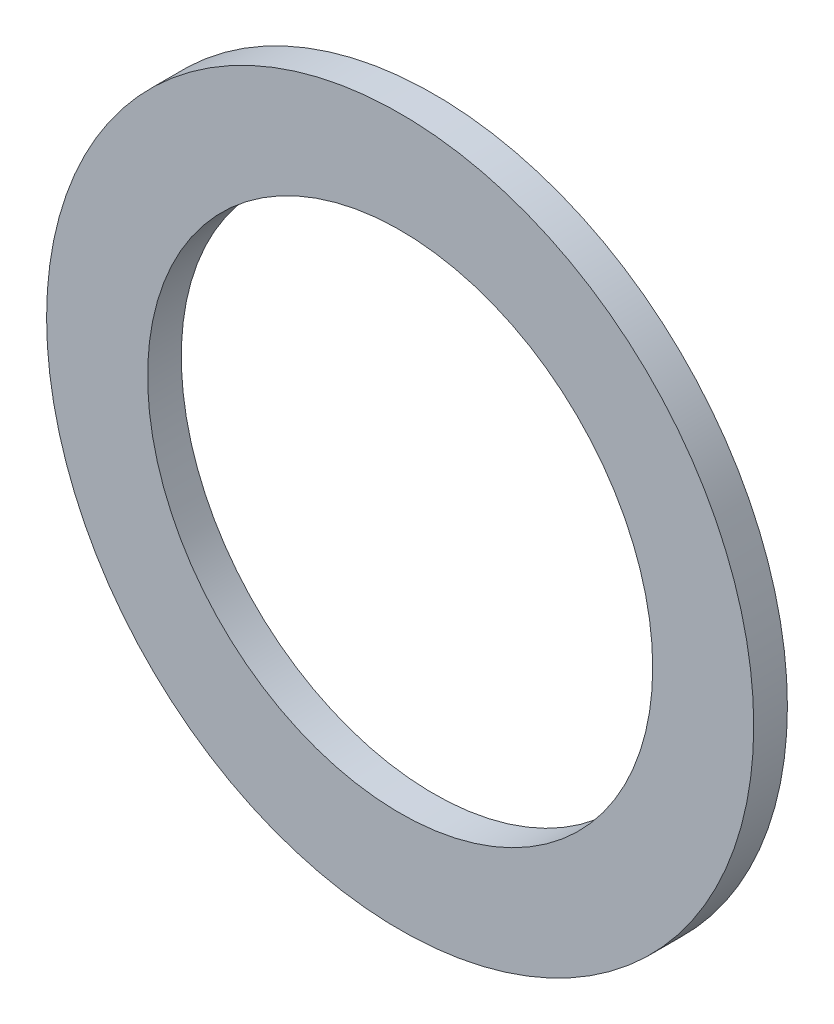
ISO-10303-21;
HEADER;
FILE_DESCRIPTION(('STEP AP214'),'2;1');
FILE_NAME('part.step','',(''),(''),'','','');
FILE_SCHEMA(('AUTOMOTIVE_DESIGN { 1 0 10303 214 1 1 1 1 }'));
ENDSEC;
DATA;
#1=APPLICATION_CONTEXT('core data for automotive mechanical design processes');
#2=APPLICATION_PROTOCOL_DEFINITION('international standard','automotive_design',2000,#1);
#3=PRODUCT_CONTEXT('',#1,'mechanical');
#4=PRODUCT('Part','Part','',(#3));
#5=PRODUCT_RELATED_PRODUCT_CATEGORY('part','',(#4));
#6=PRODUCT_DEFINITION_FORMATION('','',#4);
#7=PRODUCT_DEFINITION_CONTEXT('part definition',#1,'design');
#8=PRODUCT_DEFINITION('design','',#6,#7);
#9=PRODUCT_DEFINITION_SHAPE('','',#8);
#10=(LENGTH_UNIT() NAMED_UNIT(*) SI_UNIT(.MILLI.,.METRE.));
#11=(NAMED_UNIT(*) PLANE_ANGLE_UNIT() SI_UNIT($,.RADIAN.));
#12=(NAMED_UNIT(*) SI_UNIT($,.STERADIAN.) SOLID_ANGLE_UNIT());
#13=UNCERTAINTY_MEASURE_WITH_UNIT(LENGTH_MEASURE(1.E-05),#10,'distance_accuracy_value','');
#14=(GEOMETRIC_REPRESENTATION_CONTEXT(3) GLOBAL_UNCERTAINTY_ASSIGNED_CONTEXT((#13)) GLOBAL_UNIT_ASSIGNED_CONTEXT((#10,
#11,#12)) REPRESENTATION_CONTEXT('',''));
#15=CARTESIAN_POINT('',(0.,0.,0.));
#16=DIRECTION('',(0.,0.,1.));
#17=DIRECTION('',(1.,0.,0.));
#18=AXIS2_PLACEMENT_3D('',#15,#16,#17);
#19=CARTESIAN_POINT('',(0.,0.,1.));
#20=DIRECTION('',(0.,0.,1.));
#21=DIRECTION('',(1.,0.,0.));
#22=AXIS2_PLACEMENT_3D('',#19,#20,#21);
#23=PLANE('',#22);
#24=CARTESIAN_POINT('',(0.,0.,1.));
#25=DIRECTION('',(0.,0.,1.));
#26=DIRECTION('',(1.,0.,0.));
#27=AXIS2_PLACEMENT_3D('',#24,#25,#26);
#28=CIRCLE('',#27,10.5);
#29=CARTESIAN_POINT('',(10.5,0.,1.));
#30=VERTEX_POINT('',#29);
#31=EDGE_CURVE('E10',#30,#30,#28,.T.);
#32=ORIENTED_EDGE('',*,*,#31,.T.);
#33=EDGE_LOOP('',(#32));
#34=FACE_BOUND('',#33,.T.);
#35=CARTESIAN_POINT('',(0.,0.,1.));
#36=DIRECTION('',(0.,0.,1.));
#37=DIRECTION('',(1.,0.,0.));
#38=AXIS2_PLACEMENT_3D('',#35,#36,#37);
#39=CIRCLE('',#38,7.5);
#40=CARTESIAN_POINT('',(7.5,0.,1.));
#41=VERTEX_POINT('',#40);
#42=EDGE_CURVE('E41',#41,#41,#39,.T.);
#43=ORIENTED_EDGE('',*,*,#42,.F.);
#44=EDGE_LOOP('',(#43));
#45=FACE_BOUND('',#44,.T.);
#46=ADVANCED_FACE('F30',(#34,#45),#23,.T.);
#47=CARTESIAN_POINT('',(0.,0.,0.));
#48=DIRECTION('',(0.,0.,1.));
#49=DIRECTION('',(1.,0.,0.));
#50=AXIS2_PLACEMENT_3D('',#47,#48,#49);
#51=PLANE('',#50);
#52=CARTESIAN_POINT('',(0.,0.,0.));
#53=DIRECTION('',(0.,0.,1.));
#54=DIRECTION('',(1.,0.,0.));
#55=AXIS2_PLACEMENT_3D('',#52,#53,#54);
#56=CIRCLE('',#55,10.5);
#57=CARTESIAN_POINT('',(10.5,0.,0.));
#58=VERTEX_POINT('',#57);
#59=EDGE_CURVE('E34',#58,#58,#56,.T.);
#60=ORIENTED_EDGE('',*,*,#59,.F.);
#61=EDGE_LOOP('',(#60));
#62=FACE_BOUND('',#61,.T.);
#63=CARTESIAN_POINT('',(0.,0.,0.));
#64=DIRECTION('',(0.,0.,1.));
#65=DIRECTION('',(1.,0.,0.));
#66=AXIS2_PLACEMENT_3D('',#63,#64,#65);
#67=CIRCLE('',#66,7.5);
#68=CARTESIAN_POINT('',(7.5,0.,0.));
#69=VERTEX_POINT('',#68);
#70=EDGE_CURVE('E43',#69,#69,#67,.T.);
#71=ORIENTED_EDGE('',*,*,#70,.T.);
#72=EDGE_LOOP('',(#71));
#73=FACE_BOUND('',#72,.T.);
#74=ADVANCED_FACE('F53',(#62,#73),#51,.F.);
#75=CARTESIAN_POINT('',(0.,0.,1.));
#76=DIRECTION('',(0.,0.,-1.));
#77=DIRECTION('',(-1.,0.,0.));
#78=AXIS2_PLACEMENT_3D('',#75,#76,#77);
#79=CYLINDRICAL_SURFACE('',#78,10.5);
#80=ORIENTED_EDGE('',*,*,#31,.F.);
#81=EDGE_LOOP('',(#80));
#82=FACE_BOUND('',#81,.T.);
#83=ORIENTED_EDGE('',*,*,#59,.T.);
#84=EDGE_LOOP('',(#83));
#85=FACE_BOUND('',#84,.T.);
#86=ADVANCED_FACE('F32',(#82,#85),#79,.T.);
#87=CARTESIAN_POINT('',(0.,0.,1.));
#88=DIRECTION('',(0.,0.,-1.));
#89=DIRECTION('',(-1.,0.,0.));
#90=AXIS2_PLACEMENT_3D('',#87,#88,#89);
#91=CYLINDRICAL_SURFACE('',#90,7.5);
#92=ORIENTED_EDGE('',*,*,#42,.T.);
#93=EDGE_LOOP('',(#92));
#94=FACE_BOUND('',#93,.T.);
#95=ORIENTED_EDGE('',*,*,#70,.F.);
#96=EDGE_LOOP('',(#95));
#97=FACE_BOUND('',#96,.T.);
#98=ADVANCED_FACE('F49',(#94,#97),#91,.F.);
#99=CLOSED_SHELL('',(#46,#74,#86,#98));
#100=MANIFOLD_SOLID_BREP('B2',#99);
#101=ADVANCED_BREP_SHAPE_REPRESENTATION('',(#18,#100),#14);
#102=SHAPE_DEFINITION_REPRESENTATION(#9,#101);
ENDSEC;
END-ISO-10303-21;
